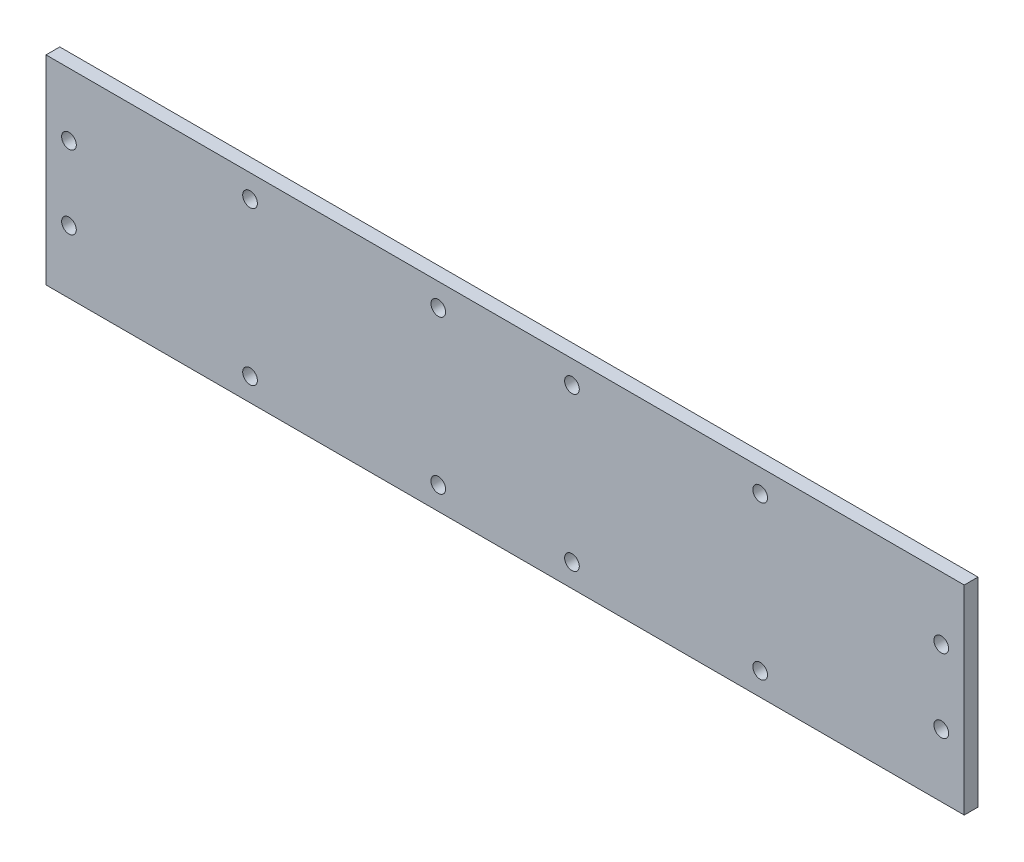
ISO-10303-21;
HEADER;
FILE_DESCRIPTION(('STEP AP214'),'2;1');
FILE_NAME('part.step','',(''),(''),'','','');
FILE_SCHEMA(('AUTOMOTIVE_DESIGN { 1 0 10303 214 1 1 1 1 }'));
ENDSEC;
DATA;
#1=APPLICATION_CONTEXT('core data for automotive mechanical design processes');
#2=APPLICATION_PROTOCOL_DEFINITION('international standard','automotive_design',2000,#1);
#3=PRODUCT_CONTEXT('',#1,'mechanical');
#4=PRODUCT('Part','Part','',(#3));
#5=PRODUCT_RELATED_PRODUCT_CATEGORY('part','',(#4));
#6=PRODUCT_DEFINITION_FORMATION('','',#4);
#7=PRODUCT_DEFINITION_CONTEXT('part definition',#1,'design');
#8=PRODUCT_DEFINITION('design','',#6,#7);
#9=PRODUCT_DEFINITION_SHAPE('','',#8);
#10=(LENGTH_UNIT() NAMED_UNIT(*) SI_UNIT(.MILLI.,.METRE.));
#11=(NAMED_UNIT(*) PLANE_ANGLE_UNIT() SI_UNIT($,.RADIAN.));
#12=(NAMED_UNIT(*) SI_UNIT($,.STERADIAN.) SOLID_ANGLE_UNIT());
#13=UNCERTAINTY_MEASURE_WITH_UNIT(LENGTH_MEASURE(1.E-05),#10,'distance_accuracy_value','');
#14=(GEOMETRIC_REPRESENTATION_CONTEXT(3) GLOBAL_UNCERTAINTY_ASSIGNED_CONTEXT((#13)) GLOBAL_UNIT_ASSIGNED_CONTEXT((#10,
#11,#12)) REPRESENTATION_CONTEXT('',''));
#15=CARTESIAN_POINT('',(0.,0.,0.));
#16=DIRECTION('',(0.,0.,1.));
#17=DIRECTION('',(1.,0.,0.));
#18=AXIS2_PLACEMENT_3D('',#15,#16,#17);
#19=CARTESIAN_POINT('',(0.,0.,3.));
#20=DIRECTION('',(0.,0.,1.));
#21=DIRECTION('',(1.,0.,0.));
#22=AXIS2_PLACEMENT_3D('',#19,#20,#21);
#23=PLANE('',#22);
#24=CARTESIAN_POINT('',(95.,-7.99999999999998,3.));
#25=DIRECTION('',(0.,0.,1.));
#26=DIRECTION('',(1.,0.,0.));
#27=AXIS2_PLACEMENT_3D('',#24,#25,#26);
#28=CIRCLE('',#27,1.60000000000001);
#29=CARTESIAN_POINT('',(96.6,-7.99999999999998,3.));
#30=VERTEX_POINT('',#29);
#31=EDGE_CURVE('E169',#30,#30,#28,.T.);
#32=ORIENTED_EDGE('',*,*,#31,.F.);
#33=EDGE_LOOP('',(#32));
#34=FACE_BOUND('',#33,.T.);
#35=CARTESIAN_POINT('',(-95.,-8.,3.));
#36=DIRECTION('',(0.,0.,1.));
#37=DIRECTION('',(-1.,0.,0.));
#38=AXIS2_PLACEMENT_3D('',#35,#36,#37);
#39=CIRCLE('',#38,1.60000000000001);
#40=CARTESIAN_POINT('',(-96.6,-8.,3.));
#41=VERTEX_POINT('',#40);
#42=EDGE_CURVE('E157',#41,#41,#39,.T.);
#43=ORIENTED_EDGE('',*,*,#42,.F.);
#44=EDGE_LOOP('',(#43));
#45=FACE_BOUND('',#44,.T.);
#46=CARTESIAN_POINT('',(-55.557299255,-16.7,3.));
#47=DIRECTION('',(0.,0.,1.));
#48=DIRECTION('',(-1.,0.,0.));
#49=AXIS2_PLACEMENT_3D('',#46,#47,#48);
#50=CIRCLE('',#49,1.6);
#51=CARTESIAN_POINT('',(-57.157299255,-16.7,3.));
#52=VERTEX_POINT('',#51);
#53=EDGE_CURVE('E145',#52,#52,#50,.T.);
#54=ORIENTED_EDGE('',*,*,#53,.F.);
#55=EDGE_LOOP('',(#54));
#56=FACE_BOUND('',#55,.T.);
#57=CARTESIAN_POINT('',(55.557299255,-16.7,3.));
#58=DIRECTION('',(0.,0.,1.));
#59=DIRECTION('',(1.,0.,0.));
#60=AXIS2_PLACEMENT_3D('',#57,#58,#59);
#61=CIRCLE('',#60,1.6);
#62=CARTESIAN_POINT('',(57.157299255,-16.7,3.));
#63=VERTEX_POINT('',#62);
#64=EDGE_CURVE('E133',#63,#63,#61,.T.);
#65=ORIENTED_EDGE('',*,*,#64,.F.);
#66=EDGE_LOOP('',(#65));
#67=FACE_BOUND('',#66,.T.);
#68=CARTESIAN_POINT('',(14.557299255,16.7,3.));
#69=DIRECTION('',(0.,0.,1.));
#70=DIRECTION('',(-1.,0.,0.));
#71=AXIS2_PLACEMENT_3D('',#68,#69,#70);
#72=CIRCLE('',#71,1.6);
#73=CARTESIAN_POINT('',(12.957299255,16.7,3.));
#74=VERTEX_POINT('',#73);
#75=EDGE_CURVE('E121',#74,#74,#72,.T.);
#76=ORIENTED_EDGE('',*,*,#75,.F.);
#77=EDGE_LOOP('',(#76));
#78=FACE_BOUND('',#77,.T.);
#79=CARTESIAN_POINT('',(-14.557299255,16.7,3.));
#80=DIRECTION('',(0.,0.,1.));
#81=DIRECTION('',(1.,0.,0.));
#82=AXIS2_PLACEMENT_3D('',#79,#80,#81);
#83=CIRCLE('',#82,1.6);
#84=CARTESIAN_POINT('',(-12.957299255,16.7,3.));
#85=VERTEX_POINT('',#84);
#86=EDGE_CURVE('E100',#85,#85,#83,.T.);
#87=ORIENTED_EDGE('',*,*,#86,.F.);
#88=EDGE_LOOP('',(#87));
#89=FACE_BOUND('',#88,.T.);
#90=DIRECTION('',(0.,-1.,0.));
#91=VECTOR('',#90,1.);
#92=CARTESIAN_POINT('',(-100.,-21.7,3.));
#93=LINE('',#92,#91);
#94=CARTESIAN_POINT('',(-100.,21.7,3.));
#95=VERTEX_POINT('',#94);
#96=CARTESIAN_POINT('',(-100.,-21.7,3.));
#97=VERTEX_POINT('',#96);
#98=EDGE_CURVE('E85',#95,#97,#93,.T.);
#99=ORIENTED_EDGE('',*,*,#98,.T.);
#100=DIRECTION('',(1.,0.,0.));
#101=VECTOR('',#100,1.);
#102=CARTESIAN_POINT('',(100.,-21.7,3.));
#103=LINE('',#102,#101);
#104=CARTESIAN_POINT('',(100.,-21.7,3.));
#105=VERTEX_POINT('',#104);
#106=EDGE_CURVE('E80',#97,#105,#103,.T.);
#107=ORIENTED_EDGE('',*,*,#106,.T.);
#108=DIRECTION('',(0.,1.,0.));
#109=VECTOR('',#108,1.);
#110=CARTESIAN_POINT('',(100.,-21.7,3.));
#111=LINE('',#110,#109);
#112=CARTESIAN_POINT('',(100.,21.7,3.));
#113=VERTEX_POINT('',#112);
#114=EDGE_CURVE('E83',#105,#113,#111,.T.);
#115=ORIENTED_EDGE('',*,*,#114,.T.);
#116=DIRECTION('',(-1.,0.,0.));
#117=VECTOR('',#116,1.);
#118=CARTESIAN_POINT('',(100.,21.7,3.));
#119=LINE('',#118,#117);
#120=EDGE_CURVE('E50',#113,#95,#119,.T.);
#121=ORIENTED_EDGE('',*,*,#120,.T.);
#122=EDGE_LOOP('',(#99,#107,#115,#121));
#123=FACE_BOUND('',#122,.T.);
#124=CARTESIAN_POINT('',(-55.557299255,16.7,3.));
#125=DIRECTION('',(0.,0.,1.));
#126=DIRECTION('',(1.,0.,0.));
#127=AXIS2_PLACEMENT_3D('',#124,#125,#126);
#128=CIRCLE('',#127,1.6);
#129=CARTESIAN_POINT('',(-53.957299255,16.7,3.));
#130=VERTEX_POINT('',#129);
#131=EDGE_CURVE('E115',#130,#130,#128,.T.);
#132=ORIENTED_EDGE('',*,*,#131,.F.);
#133=EDGE_LOOP('',(#132));
#134=FACE_BOUND('',#133,.T.);
#135=CARTESIAN_POINT('',(55.557299255,16.7,3.));
#136=DIRECTION('',(0.,0.,1.));
#137=DIRECTION('',(-1.,0.,0.));
#138=AXIS2_PLACEMENT_3D('',#135,#136,#137);
#139=CIRCLE('',#138,1.6);
#140=CARTESIAN_POINT('',(53.957299255,16.7,3.));
#141=VERTEX_POINT('',#140);
#142=EDGE_CURVE('E127',#141,#141,#139,.T.);
#143=ORIENTED_EDGE('',*,*,#142,.F.);
#144=EDGE_LOOP('',(#143));
#145=FACE_BOUND('',#144,.T.);
#146=CARTESIAN_POINT('',(14.557299255,-16.7,3.));
#147=DIRECTION('',(0.,0.,1.));
#148=DIRECTION('',(1.,0.,0.));
#149=AXIS2_PLACEMENT_3D('',#146,#147,#148);
#150=CIRCLE('',#149,1.6);
#151=CARTESIAN_POINT('',(16.157299255,-16.7,3.));
#152=VERTEX_POINT('',#151);
#153=EDGE_CURVE('E139',#152,#152,#150,.T.);
#154=ORIENTED_EDGE('',*,*,#153,.F.);
#155=EDGE_LOOP('',(#154));
#156=FACE_BOUND('',#155,.T.);
#157=CARTESIAN_POINT('',(-14.557299255,-16.7,3.));
#158=DIRECTION('',(0.,0.,1.));
#159=DIRECTION('',(-1.,0.,0.));
#160=AXIS2_PLACEMENT_3D('',#157,#158,#159);
#161=CIRCLE('',#160,1.6);
#162=CARTESIAN_POINT('',(-16.157299255,-16.7,3.));
#163=VERTEX_POINT('',#162);
#164=EDGE_CURVE('E151',#163,#163,#161,.T.);
#165=ORIENTED_EDGE('',*,*,#164,.F.);
#166=EDGE_LOOP('',(#165));
#167=FACE_BOUND('',#166,.T.);
#168=CARTESIAN_POINT('',(-95.,8.,3.));
#169=DIRECTION('',(0.,0.,1.));
#170=DIRECTION('',(1.,0.,0.));
#171=AXIS2_PLACEMENT_3D('',#168,#169,#170);
#172=CIRCLE('',#171,1.6);
#173=CARTESIAN_POINT('',(-93.4,8.,3.));
#174=VERTEX_POINT('',#173);
#175=EDGE_CURVE('E163',#174,#174,#172,.T.);
#176=ORIENTED_EDGE('',*,*,#175,.F.);
#177=EDGE_LOOP('',(#176));
#178=FACE_BOUND('',#177,.T.);
#179=CARTESIAN_POINT('',(95.,7.99999999999998,3.));
#180=DIRECTION('',(0.,0.,1.));
#181=DIRECTION('',(-1.,0.,0.));
#182=AXIS2_PLACEMENT_3D('',#179,#180,#181);
#183=CIRCLE('',#182,1.6);
#184=CARTESIAN_POINT('',(93.4,7.99999999999998,3.));
#185=VERTEX_POINT('',#184);
#186=EDGE_CURVE('E175',#185,#185,#183,.T.);
#187=ORIENTED_EDGE('',*,*,#186,.F.);
#188=EDGE_LOOP('',(#187));
#189=FACE_BOUND('',#188,.T.);
#190=ADVANCED_FACE('F33',(#34,#45,#56,#67,#78,#89,#123,#134,#145,#156,#167,#178,#189),#23,.T.);
#191=CARTESIAN_POINT('',(0.,0.,0.));
#192=DIRECTION('',(0.,0.,1.));
#193=DIRECTION('',(1.,0.,0.));
#194=AXIS2_PLACEMENT_3D('',#191,#192,#193);
#195=PLANE('',#194);
#196=DIRECTION('',(0.,-1.,0.));
#197=VECTOR('',#196,1.);
#198=CARTESIAN_POINT('',(-100.,-21.7,0.));
#199=LINE('',#198,#197);
#200=CARTESIAN_POINT('',(-100.,21.7,0.));
#201=VERTEX_POINT('',#200);
#202=CARTESIAN_POINT('',(-100.,-21.7,0.));
#203=VERTEX_POINT('',#202);
#204=EDGE_CURVE('E97',#201,#203,#199,.T.);
#205=ORIENTED_EDGE('',*,*,#204,.F.);
#206=DIRECTION('',(-1.,0.,0.));
#207=VECTOR('',#206,1.);
#208=CARTESIAN_POINT('',(100.,21.7,0.));
#209=LINE('',#208,#207);
#210=CARTESIAN_POINT('',(100.,21.7,0.));
#211=VERTEX_POINT('',#210);
#212=EDGE_CURVE('E73',#211,#201,#209,.T.);
#213=ORIENTED_EDGE('',*,*,#212,.F.);
#214=DIRECTION('',(0.,1.,0.));
#215=VECTOR('',#214,1.);
#216=CARTESIAN_POINT('',(100.,-21.7,0.));
#217=LINE('',#216,#215);
#218=CARTESIAN_POINT('',(100.,-21.7,0.));
#219=VERTEX_POINT('',#218);
#220=EDGE_CURVE('E67',#219,#211,#217,.T.);
#221=ORIENTED_EDGE('',*,*,#220,.F.);
#222=DIRECTION('',(1.,0.,0.));
#223=VECTOR('',#222,1.);
#224=CARTESIAN_POINT('',(100.,-21.7,0.));
#225=LINE('',#224,#223);
#226=EDGE_CURVE('E89',#203,#219,#225,.T.);
#227=ORIENTED_EDGE('',*,*,#226,.F.);
#228=EDGE_LOOP('',(#205,#213,#221,#227));
#229=FACE_BOUND('',#228,.T.);
#230=CARTESIAN_POINT('',(-14.557299255,16.7,0.));
#231=DIRECTION('',(0.,0.,1.));
#232=DIRECTION('',(1.,0.,0.));
#233=AXIS2_PLACEMENT_3D('',#230,#231,#232);
#234=CIRCLE('',#233,1.6);
#235=CARTESIAN_POINT('',(-12.957299255,16.7,0.));
#236=VERTEX_POINT('',#235);
#237=EDGE_CURVE('E112',#236,#236,#234,.T.);
#238=ORIENTED_EDGE('',*,*,#237,.T.);
#239=EDGE_LOOP('',(#238));
#240=FACE_BOUND('',#239,.T.);
#241=CARTESIAN_POINT('',(-55.557299255,16.7,0.));
#242=DIRECTION('',(0.,0.,1.));
#243=DIRECTION('',(1.,0.,0.));
#244=AXIS2_PLACEMENT_3D('',#241,#242,#243);
#245=CIRCLE('',#244,1.6);
#246=CARTESIAN_POINT('',(-53.957299255,16.7,0.));
#247=VERTEX_POINT('',#246);
#248=EDGE_CURVE('E118',#247,#247,#245,.T.);
#249=ORIENTED_EDGE('',*,*,#248,.T.);
#250=EDGE_LOOP('',(#249));
#251=FACE_BOUND('',#250,.T.);
#252=CARTESIAN_POINT('',(14.557299255,16.7,0.));
#253=DIRECTION('',(0.,0.,1.));
#254=DIRECTION('',(-1.,0.,0.));
#255=AXIS2_PLACEMENT_3D('',#252,#253,#254);
#256=CIRCLE('',#255,1.6);
#257=CARTESIAN_POINT('',(12.957299255,16.7,0.));
#258=VERTEX_POINT('',#257);
#259=EDGE_CURVE('E124',#258,#258,#256,.T.);
#260=ORIENTED_EDGE('',*,*,#259,.T.);
#261=EDGE_LOOP('',(#260));
#262=FACE_BOUND('',#261,.T.);
#263=CARTESIAN_POINT('',(55.557299255,16.7,0.));
#264=DIRECTION('',(0.,0.,1.));
#265=DIRECTION('',(-1.,0.,0.));
#266=AXIS2_PLACEMENT_3D('',#263,#264,#265);
#267=CIRCLE('',#266,1.6);
#268=CARTESIAN_POINT('',(53.957299255,16.7,0.));
#269=VERTEX_POINT('',#268);
#270=EDGE_CURVE('E130',#269,#269,#267,.T.);
#271=ORIENTED_EDGE('',*,*,#270,.T.);
#272=EDGE_LOOP('',(#271));
#273=FACE_BOUND('',#272,.T.);
#274=CARTESIAN_POINT('',(55.557299255,-16.7,0.));
#275=DIRECTION('',(0.,0.,1.));
#276=DIRECTION('',(1.,0.,0.));
#277=AXIS2_PLACEMENT_3D('',#274,#275,#276);
#278=CIRCLE('',#277,1.6);
#279=CARTESIAN_POINT('',(57.157299255,-16.7,0.));
#280=VERTEX_POINT('',#279);
#281=EDGE_CURVE('E136',#280,#280,#278,.T.);
#282=ORIENTED_EDGE('',*,*,#281,.T.);
#283=EDGE_LOOP('',(#282));
#284=FACE_BOUND('',#283,.T.);
#285=CARTESIAN_POINT('',(14.557299255,-16.7,0.));
#286=DIRECTION('',(0.,0.,1.));
#287=DIRECTION('',(1.,0.,0.));
#288=AXIS2_PLACEMENT_3D('',#285,#286,#287);
#289=CIRCLE('',#288,1.6);
#290=CARTESIAN_POINT('',(16.157299255,-16.7,0.));
#291=VERTEX_POINT('',#290);
#292=EDGE_CURVE('E142',#291,#291,#289,.T.);
#293=ORIENTED_EDGE('',*,*,#292,.T.);
#294=EDGE_LOOP('',(#293));
#295=FACE_BOUND('',#294,.T.);
#296=CARTESIAN_POINT('',(-55.557299255,-16.7,0.));
#297=DIRECTION('',(0.,0.,1.));
#298=DIRECTION('',(-1.,0.,0.));
#299=AXIS2_PLACEMENT_3D('',#296,#297,#298);
#300=CIRCLE('',#299,1.6);
#301=CARTESIAN_POINT('',(-57.157299255,-16.7,0.));
#302=VERTEX_POINT('',#301);
#303=EDGE_CURVE('E148',#302,#302,#300,.T.);
#304=ORIENTED_EDGE('',*,*,#303,.T.);
#305=EDGE_LOOP('',(#304));
#306=FACE_BOUND('',#305,.T.);
#307=CARTESIAN_POINT('',(-14.557299255,-16.7,0.));
#308=DIRECTION('',(0.,0.,1.));
#309=DIRECTION('',(-1.,0.,0.));
#310=AXIS2_PLACEMENT_3D('',#307,#308,#309);
#311=CIRCLE('',#310,1.6);
#312=CARTESIAN_POINT('',(-16.157299255,-16.7,0.));
#313=VERTEX_POINT('',#312);
#314=EDGE_CURVE('E154',#313,#313,#311,.T.);
#315=ORIENTED_EDGE('',*,*,#314,.T.);
#316=EDGE_LOOP('',(#315));
#317=FACE_BOUND('',#316,.T.);
#318=CARTESIAN_POINT('',(-95.,-8.,0.));
#319=DIRECTION('',(0.,0.,1.));
#320=DIRECTION('',(-1.,0.,0.));
#321=AXIS2_PLACEMENT_3D('',#318,#319,#320);
#322=CIRCLE('',#321,1.60000000000001);
#323=CARTESIAN_POINT('',(-96.6,-8.,0.));
#324=VERTEX_POINT('',#323);
#325=EDGE_CURVE('E160',#324,#324,#322,.T.);
#326=ORIENTED_EDGE('',*,*,#325,.T.);
#327=EDGE_LOOP('',(#326));
#328=FACE_BOUND('',#327,.T.);
#329=CARTESIAN_POINT('',(-95.,8.,0.));
#330=DIRECTION('',(0.,0.,1.));
#331=DIRECTION('',(1.,0.,0.));
#332=AXIS2_PLACEMENT_3D('',#329,#330,#331);
#333=CIRCLE('',#332,1.6);
#334=CARTESIAN_POINT('',(-93.4,8.,0.));
#335=VERTEX_POINT('',#334);
#336=EDGE_CURVE('E166',#335,#335,#333,.T.);
#337=ORIENTED_EDGE('',*,*,#336,.T.);
#338=EDGE_LOOP('',(#337));
#339=FACE_BOUND('',#338,.T.);
#340=CARTESIAN_POINT('',(95.,-7.99999999999998,0.));
#341=DIRECTION('',(0.,0.,1.));
#342=DIRECTION('',(1.,0.,0.));
#343=AXIS2_PLACEMENT_3D('',#340,#341,#342);
#344=CIRCLE('',#343,1.60000000000001);
#345=CARTESIAN_POINT('',(96.6,-7.99999999999998,0.));
#346=VERTEX_POINT('',#345);
#347=EDGE_CURVE('E172',#346,#346,#344,.T.);
#348=ORIENTED_EDGE('',*,*,#347,.T.);
#349=EDGE_LOOP('',(#348));
#350=FACE_BOUND('',#349,.T.);
#351=CARTESIAN_POINT('',(95.,7.99999999999998,0.));
#352=DIRECTION('',(0.,0.,1.));
#353=DIRECTION('',(-1.,0.,0.));
#354=AXIS2_PLACEMENT_3D('',#351,#352,#353);
#355=CIRCLE('',#354,1.6);
#356=CARTESIAN_POINT('',(93.4,7.99999999999998,0.));
#357=VERTEX_POINT('',#356);
#358=EDGE_CURVE('E178',#357,#357,#355,.T.);
#359=ORIENTED_EDGE('',*,*,#358,.T.);
#360=EDGE_LOOP('',(#359));
#361=FACE_BOUND('',#360,.T.);
#362=ADVANCED_FACE('F108',(#229,#240,#251,#262,#273,#284,#295,#306,#317,#328,#339,#350,#361),
#195,.F.);
#363=CARTESIAN_POINT('',(-100.,-21.7,3.));
#364=DIRECTION('',(1.,0.,0.));
#365=DIRECTION('',(0.,0.,-1.));
#366=AXIS2_PLACEMENT_3D('',#363,#364,#365);
#367=PLANE('',#366);
#368=ORIENTED_EDGE('',*,*,#204,.T.);
#369=DIRECTION('',(0.,0.,-1.));
#370=VECTOR('',#369,1.);
#371=CARTESIAN_POINT('',(-100.,-21.7,3.));
#372=LINE('',#371,#370);
#373=EDGE_CURVE('E11',#97,#203,#372,.T.);
#374=ORIENTED_EDGE('',*,*,#373,.F.);
#375=ORIENTED_EDGE('',*,*,#98,.F.);
#376=DIRECTION('',(0.,0.,-1.));
#377=VECTOR('',#376,1.);
#378=CARTESIAN_POINT('',(-100.,21.7,3.));
#379=LINE('',#378,#377);
#380=EDGE_CURVE('E93',#95,#201,#379,.T.);
#381=ORIENTED_EDGE('',*,*,#380,.T.);
#382=EDGE_LOOP('',(#368,#374,#375,#381));
#383=FACE_BOUND('',#382,.T.);
#384=ADVANCED_FACE('F35',(#383),#367,.F.);
#385=CARTESIAN_POINT('',(100.,-21.7,3.));
#386=DIRECTION('',(0.,1.,0.));
#387=DIRECTION('',(-1.,0.,0.));
#388=AXIS2_PLACEMENT_3D('',#385,#386,#387);
#389=PLANE('',#388);
#390=ORIENTED_EDGE('',*,*,#226,.T.);
#391=DIRECTION('',(0.,0.,-1.));
#392=VECTOR('',#391,1.);
#393=CARTESIAN_POINT('',(100.,-21.7,3.));
#394=LINE('',#393,#392);
#395=EDGE_CURVE('E42',#105,#219,#394,.T.);
#396=ORIENTED_EDGE('',*,*,#395,.F.);
#397=ORIENTED_EDGE('',*,*,#106,.F.);
#398=ORIENTED_EDGE('',*,*,#373,.T.);
#399=EDGE_LOOP('',(#390,#396,#397,#398));
#400=FACE_BOUND('',#399,.T.);
#401=ADVANCED_FACE('F88',(#400),#389,.F.);
#402=CARTESIAN_POINT('',(100.,-21.7,3.));
#403=DIRECTION('',(-1.,0.,0.));
#404=DIRECTION('',(0.,0.,1.));
#405=AXIS2_PLACEMENT_3D('',#402,#403,#404);
#406=PLANE('',#405);
#407=ORIENTED_EDGE('',*,*,#220,.T.);
#408=DIRECTION('',(0.,0.,-1.));
#409=VECTOR('',#408,1.);
#410=CARTESIAN_POINT('',(100.,21.7,3.));
#411=LINE('',#410,#409);
#412=EDGE_CURVE('E90',#113,#211,#411,.T.);
#413=ORIENTED_EDGE('',*,*,#412,.F.);
#414=ORIENTED_EDGE('',*,*,#114,.F.);
#415=ORIENTED_EDGE('',*,*,#395,.T.);
#416=EDGE_LOOP('',(#407,#413,#414,#415));
#417=FACE_BOUND('',#416,.T.);
#418=ADVANCED_FACE('F91',(#417),#406,.F.);
#419=CARTESIAN_POINT('',(100.,21.7,3.));
#420=DIRECTION('',(0.,-1.,0.));
#421=DIRECTION('',(1.,0.,0.));
#422=AXIS2_PLACEMENT_3D('',#419,#420,#421);
#423=PLANE('',#422);
#424=ORIENTED_EDGE('',*,*,#212,.T.);
#425=ORIENTED_EDGE('',*,*,#380,.F.);
#426=ORIENTED_EDGE('',*,*,#120,.F.);
#427=ORIENTED_EDGE('',*,*,#412,.T.);
#428=EDGE_LOOP('',(#424,#425,#426,#427));
#429=FACE_BOUND('',#428,.T.);
#430=ADVANCED_FACE('F105',(#429),#423,.F.);
#431=CARTESIAN_POINT('',(-14.557299255,16.7,3.));
#432=DIRECTION('',(0.,0.,-1.));
#433=DIRECTION('',(-1.,0.,0.));
#434=AXIS2_PLACEMENT_3D('',#431,#432,#433);
#435=CYLINDRICAL_SURFACE('',#434,1.6);
#436=ORIENTED_EDGE('',*,*,#86,.T.);
#437=EDGE_LOOP('',(#436));
#438=FACE_BOUND('',#437,.T.);
#439=ORIENTED_EDGE('',*,*,#237,.F.);
#440=EDGE_LOOP('',(#439));
#441=FACE_BOUND('',#440,.T.);
#442=ADVANCED_FACE('F197',(#438,#441),#435,.F.);
#443=CARTESIAN_POINT('',(-55.557299255,16.7,3.));
#444=DIRECTION('',(0.,0.,-1.));
#445=DIRECTION('',(-1.,0.,0.));
#446=AXIS2_PLACEMENT_3D('',#443,#444,#445);
#447=CYLINDRICAL_SURFACE('',#446,1.6);
#448=ORIENTED_EDGE('',*,*,#131,.T.);
#449=EDGE_LOOP('',(#448));
#450=FACE_BOUND('',#449,.T.);
#451=ORIENTED_EDGE('',*,*,#248,.F.);
#452=EDGE_LOOP('',(#451));
#453=FACE_BOUND('',#452,.T.);
#454=ADVANCED_FACE('F243',(#450,#453),#447,.F.);
#455=CARTESIAN_POINT('',(14.557299255,16.7,3.));
#456=DIRECTION('',(0.,0.,-1.));
#457=DIRECTION('',(-1.,0.,0.));
#458=AXIS2_PLACEMENT_3D('',#455,#456,#457);
#459=CYLINDRICAL_SURFACE('',#458,1.6);
#460=ORIENTED_EDGE('',*,*,#75,.T.);
#461=EDGE_LOOP('',(#460));
#462=FACE_BOUND('',#461,.T.);
#463=ORIENTED_EDGE('',*,*,#259,.F.);
#464=EDGE_LOOP('',(#463));
#465=FACE_BOUND('',#464,.T.);
#466=ADVANCED_FACE('F251',(#462,#465),#459,.F.);
#467=CARTESIAN_POINT('',(55.557299255,16.7,3.));
#468=DIRECTION('',(0.,0.,-1.));
#469=DIRECTION('',(-1.,0.,0.));
#470=AXIS2_PLACEMENT_3D('',#467,#468,#469);
#471=CYLINDRICAL_SURFACE('',#470,1.6);
#472=ORIENTED_EDGE('',*,*,#142,.T.);
#473=EDGE_LOOP('',(#472));
#474=FACE_BOUND('',#473,.T.);
#475=ORIENTED_EDGE('',*,*,#270,.F.);
#476=EDGE_LOOP('',(#475));
#477=FACE_BOUND('',#476,.T.);
#478=ADVANCED_FACE('F259',(#474,#477),#471,.F.);
#479=CARTESIAN_POINT('',(55.557299255,-16.7,3.));
#480=DIRECTION('',(0.,0.,-1.));
#481=DIRECTION('',(-1.,0.,0.));
#482=AXIS2_PLACEMENT_3D('',#479,#480,#481);
#483=CYLINDRICAL_SURFACE('',#482,1.6);
#484=ORIENTED_EDGE('',*,*,#64,.T.);
#485=EDGE_LOOP('',(#484));
#486=FACE_BOUND('',#485,.T.);
#487=ORIENTED_EDGE('',*,*,#281,.F.);
#488=EDGE_LOOP('',(#487));
#489=FACE_BOUND('',#488,.T.);
#490=ADVANCED_FACE('F268',(#486,#489),#483,.F.);
#491=CARTESIAN_POINT('',(14.557299255,-16.7,3.));
#492=DIRECTION('',(0.,0.,-1.));
#493=DIRECTION('',(-1.,0.,0.));
#494=AXIS2_PLACEMENT_3D('',#491,#492,#493);
#495=CYLINDRICAL_SURFACE('',#494,1.6);
#496=ORIENTED_EDGE('',*,*,#153,.T.);
#497=EDGE_LOOP('',(#496));
#498=FACE_BOUND('',#497,.T.);
#499=ORIENTED_EDGE('',*,*,#292,.F.);
#500=EDGE_LOOP('',(#499));
#501=FACE_BOUND('',#500,.T.);
#502=ADVANCED_FACE('F277',(#498,#501),#495,.F.);
#503=CARTESIAN_POINT('',(-55.557299255,-16.7,3.));
#504=DIRECTION('',(0.,0.,-1.));
#505=DIRECTION('',(-1.,0.,0.));
#506=AXIS2_PLACEMENT_3D('',#503,#504,#505);
#507=CYLINDRICAL_SURFACE('',#506,1.6);
#508=ORIENTED_EDGE('',*,*,#53,.T.);
#509=EDGE_LOOP('',(#508));
#510=FACE_BOUND('',#509,.T.);
#511=ORIENTED_EDGE('',*,*,#303,.F.);
#512=EDGE_LOOP('',(#511));
#513=FACE_BOUND('',#512,.T.);
#514=ADVANCED_FACE('F286',(#510,#513),#507,.F.);
#515=CARTESIAN_POINT('',(-14.557299255,-16.7,3.));
#516=DIRECTION('',(0.,0.,-1.));
#517=DIRECTION('',(-1.,0.,0.));
#518=AXIS2_PLACEMENT_3D('',#515,#516,#517);
#519=CYLINDRICAL_SURFACE('',#518,1.6);
#520=ORIENTED_EDGE('',*,*,#164,.T.);
#521=EDGE_LOOP('',(#520));
#522=FACE_BOUND('',#521,.T.);
#523=ORIENTED_EDGE('',*,*,#314,.F.);
#524=EDGE_LOOP('',(#523));
#525=FACE_BOUND('',#524,.T.);
#526=ADVANCED_FACE('F295',(#522,#525),#519,.F.);
#527=CARTESIAN_POINT('',(-95.,-8.,3.));
#528=DIRECTION('',(0.,0.,-1.));
#529=DIRECTION('',(-1.,0.,0.));
#530=AXIS2_PLACEMENT_3D('',#527,#528,#529);
#531=CYLINDRICAL_SURFACE('',#530,1.60000000000001);
#532=ORIENTED_EDGE('',*,*,#42,.T.);
#533=EDGE_LOOP('',(#532));
#534=FACE_BOUND('',#533,.T.);
#535=ORIENTED_EDGE('',*,*,#325,.F.);
#536=EDGE_LOOP('',(#535));
#537=FACE_BOUND('',#536,.T.);
#538=ADVANCED_FACE('F304',(#534,#537),#531,.F.);
#539=CARTESIAN_POINT('',(-95.,8.,3.));
#540=DIRECTION('',(0.,0.,-1.));
#541=DIRECTION('',(-1.,0.,0.));
#542=AXIS2_PLACEMENT_3D('',#539,#540,#541);
#543=CYLINDRICAL_SURFACE('',#542,1.6);
#544=ORIENTED_EDGE('',*,*,#175,.T.);
#545=EDGE_LOOP('',(#544));
#546=FACE_BOUND('',#545,.T.);
#547=ORIENTED_EDGE('',*,*,#336,.F.);
#548=EDGE_LOOP('',(#547));
#549=FACE_BOUND('',#548,.T.);
#550=ADVANCED_FACE('F313',(#546,#549),#543,.F.);
#551=CARTESIAN_POINT('',(95.,-7.99999999999998,3.));
#552=DIRECTION('',(0.,0.,-1.));
#553=DIRECTION('',(-1.,0.,0.));
#554=AXIS2_PLACEMENT_3D('',#551,#552,#553);
#555=CYLINDRICAL_SURFACE('',#554,1.60000000000001);
#556=ORIENTED_EDGE('',*,*,#31,.T.);
#557=EDGE_LOOP('',(#556));
#558=FACE_BOUND('',#557,.T.);
#559=ORIENTED_EDGE('',*,*,#347,.F.);
#560=EDGE_LOOP('',(#559));
#561=FACE_BOUND('',#560,.T.);
#562=ADVANCED_FACE('F322',(#558,#561),#555,.F.);
#563=CARTESIAN_POINT('',(95.,7.99999999999998,3.));
#564=DIRECTION('',(0.,0.,-1.));
#565=DIRECTION('',(-1.,0.,0.));
#566=AXIS2_PLACEMENT_3D('',#563,#564,#565);
#567=CYLINDRICAL_SURFACE('',#566,1.6);
#568=ORIENTED_EDGE('',*,*,#186,.T.);
#569=EDGE_LOOP('',(#568));
#570=FACE_BOUND('',#569,.T.);
#571=ORIENTED_EDGE('',*,*,#358,.F.);
#572=EDGE_LOOP('',(#571));
#573=FACE_BOUND('',#572,.T.);
#574=ADVANCED_FACE('F184',(#570,#573),#567,.F.);
#575=CLOSED_SHELL('',(#190,#362,#384,#401,#418,#430,#442,#454,#466,#478,#490,#502,#514,#526,
#538,#550,#562,#574));
#576=MANIFOLD_SOLID_BREP('B2',#575);
#577=ADVANCED_BREP_SHAPE_REPRESENTATION('',(#18,#576),#14);
#578=SHAPE_DEFINITION_REPRESENTATION(#9,#577);
ENDSEC;
END-ISO-10303-21;
